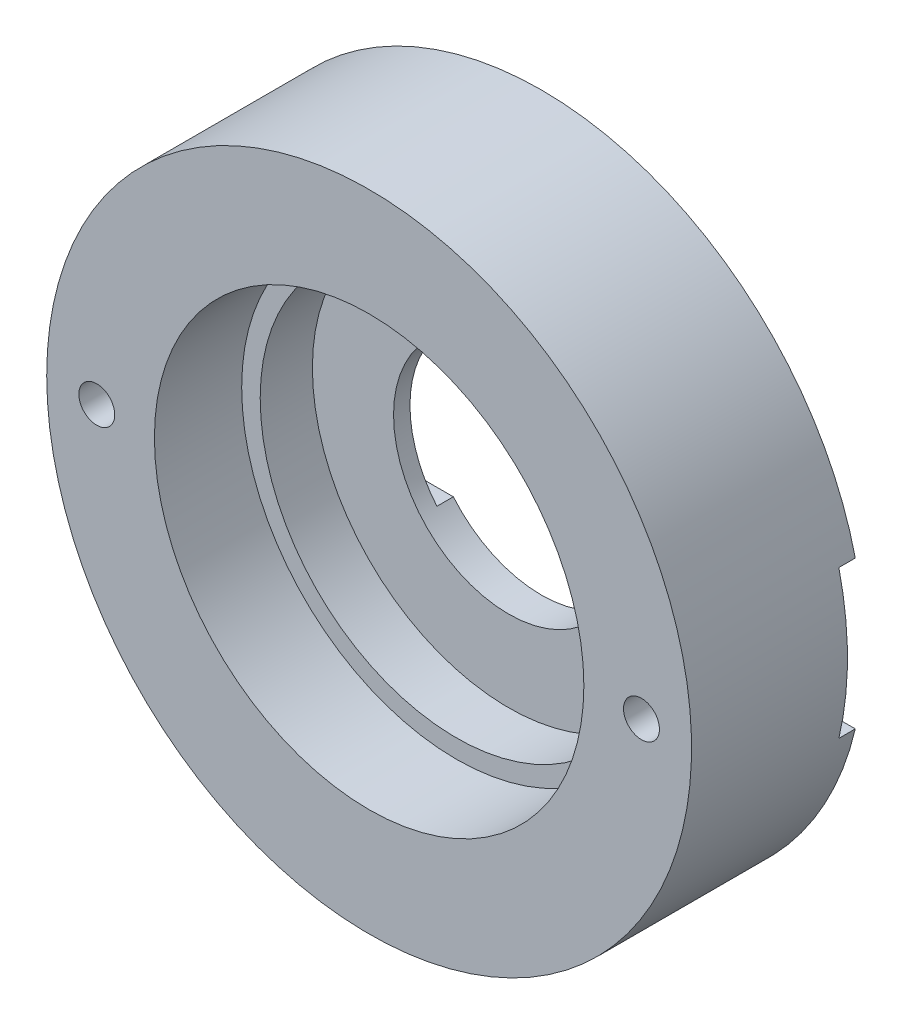
ISO-10303-21;
HEADER;
FILE_DESCRIPTION(('STEP AP214'),'2;1');
FILE_NAME('part.step','',(''),(''),'','','');
FILE_SCHEMA(('AUTOMOTIVE_DESIGN { 1 0 10303 214 1 1 1 1 }'));
ENDSEC;
DATA;
#1=APPLICATION_CONTEXT('core data for automotive mechanical design processes');
#2=APPLICATION_PROTOCOL_DEFINITION('international standard','automotive_design',2000,#1);
#3=PRODUCT_CONTEXT('',#1,'mechanical');
#4=PRODUCT('Part','Part','',(#3));
#5=PRODUCT_RELATED_PRODUCT_CATEGORY('part','',(#4));
#6=PRODUCT_DEFINITION_FORMATION('','',#4);
#7=PRODUCT_DEFINITION_CONTEXT('part definition',#1,'design');
#8=PRODUCT_DEFINITION('design','',#6,#7);
#9=PRODUCT_DEFINITION_SHAPE('','',#8);
#10=(LENGTH_UNIT() NAMED_UNIT(*) SI_UNIT(.MILLI.,.METRE.));
#11=(NAMED_UNIT(*) PLANE_ANGLE_UNIT() SI_UNIT($,.RADIAN.));
#12=(NAMED_UNIT(*) SI_UNIT($,.STERADIAN.) SOLID_ANGLE_UNIT());
#13=UNCERTAINTY_MEASURE_WITH_UNIT(LENGTH_MEASURE(1.E-05),#10,'distance_accuracy_value','');
#14=(GEOMETRIC_REPRESENTATION_CONTEXT(3) GLOBAL_UNCERTAINTY_ASSIGNED_CONTEXT((#13)) GLOBAL_UNIT_ASSIGNED_CONTEXT((#10,
#11,#12)) REPRESENTATION_CONTEXT('',''));
#15=CARTESIAN_POINT('',(0.,0.,0.));
#16=DIRECTION('',(0.,0.,1.));
#17=DIRECTION('',(1.,0.,0.));
#18=AXIS2_PLACEMENT_3D('',#15,#16,#17);
#19=CARTESIAN_POINT('',(0.,0.,-4.70047346479343));
#20=DIRECTION('',(0.,0.,-1.));
#21=DIRECTION('',(-1.,0.,0.));
#22=AXIS2_PLACEMENT_3D('',#19,#20,#21);
#23=PLANE('',#22);
#24=DIRECTION('',(-1.,0.,0.));
#25=VECTOR('',#24,1.);
#26=CARTESIAN_POINT('',(22.5619464921962,-4.5,-4.70047346479343));
#27=LINE('',#26,#25);
#28=CARTESIAN_POINT('',(19.0947333577398,-4.5,-4.70047346479343));
#29=VERTEX_POINT('',#28);
#30=CARTESIAN_POINT('',(5.3619026473818,-4.5,-4.70047346479343));
#31=VERTEX_POINT('',#30);
#32=EDGE_CURVE('E157',#29,#31,#27,.T.);
#33=ORIENTED_EDGE('',*,*,#32,.F.);
#34=CARTESIAN_POINT('',(0.,0.,-4.70047346479343));
#35=DIRECTION('',(0.,0.,-1.));
#36=DIRECTION('',(-1.,0.,0.));
#37=AXIS2_PLACEMENT_3D('',#34,#35,#36);
#38=CIRCLE('',#37,19.6178195017485);
#39=CARTESIAN_POINT('',(-19.0947333577398,-4.5,-4.70047346479343));
#40=VERTEX_POINT('',#39);
#41=EDGE_CURVE('E127',#29,#40,#38,.T.);
#42=ORIENTED_EDGE('',*,*,#41,.T.);
#43=CARTESIAN_POINT('',(-5.3619026473818,-4.5,-4.70047346479343));
#44=VERTEX_POINT('',#43);
#45=EDGE_CURVE('E118',#44,#40,#27,.T.);
#46=ORIENTED_EDGE('',*,*,#45,.F.);
#47=CARTESIAN_POINT('',(0.,0.,-4.70047346479343));
#48=DIRECTION('',(0.,0.,-1.));
#49=DIRECTION('',(-1.,0.,0.));
#50=AXIS2_PLACEMENT_3D('',#47,#48,#49);
#51=CIRCLE('',#50,7.);
#52=EDGE_CURVE('E175',#31,#44,#51,.T.);
#53=ORIENTED_EDGE('',*,*,#52,.F.);
#54=EDGE_LOOP('',(#33,#42,#46,#53));
#55=FACE_BOUND('',#54,.T.);
#56=ADVANCED_FACE('F36',(#55),#23,.T.);
#57=CARTESIAN_POINT('',(-16.57,0.,5.78452653520657));
#58=DIRECTION('',(0.,0.,-1.));
#59=DIRECTION('',(-1.,0.,0.));
#60=AXIS2_PLACEMENT_3D('',#57,#58,#59);
#61=CYLINDRICAL_SURFACE('',#60,1.0922);
#62=CARTESIAN_POINT('',(-16.57,0.,5.78452653520657));
#63=DIRECTION('',(0.,0.,-1.));
#64=DIRECTION('',(-1.,0.,0.));
#65=AXIS2_PLACEMENT_3D('',#62,#63,#64);
#66=CIRCLE('',#65,1.0922);
#67=CARTESIAN_POINT('',(-17.6622,0.,5.78452653520657));
#68=VERTEX_POINT('',#67);
#69=EDGE_CURVE('E172',#68,#68,#66,.T.);
#70=ORIENTED_EDGE('',*,*,#69,.F.);
#71=EDGE_LOOP('',(#70));
#72=FACE_BOUND('',#71,.T.);
#73=CARTESIAN_POINT('',(-16.57,0.,-3.70047346479343));
#74=DIRECTION('',(0.,0.,-1.));
#75=DIRECTION('',(-1.,0.,0.));
#76=AXIS2_PLACEMENT_3D('',#73,#74,#75);
#77=CIRCLE('',#76,1.0922);
#78=CARTESIAN_POINT('',(-17.6622,0.,-3.70047346479343));
#79=VERTEX_POINT('',#78);
#80=EDGE_CURVE('E138',#79,#79,#77,.F.);
#81=ORIENTED_EDGE('',*,*,#80,.F.);
#82=EDGE_LOOP('',(#81));
#83=FACE_BOUND('',#82,.T.);
#84=ADVANCED_FACE('F209',(#72,#83),#61,.F.);
#85=CARTESIAN_POINT('',(16.57,0.,5.78452653520657));
#86=DIRECTION('',(0.,0.,-1.));
#87=DIRECTION('',(-1.,0.,0.));
#88=AXIS2_PLACEMENT_3D('',#85,#86,#87);
#89=CYLINDRICAL_SURFACE('',#88,1.0922);
#90=CARTESIAN_POINT('',(16.57,0.,5.78452653520657));
#91=DIRECTION('',(0.,0.,-1.));
#92=DIRECTION('',(1.,0.,0.));
#93=AXIS2_PLACEMENT_3D('',#90,#91,#92);
#94=CIRCLE('',#93,1.0922);
#95=CARTESIAN_POINT('',(17.6622,0.,5.78452653520657));
#96=VERTEX_POINT('',#95);
#97=EDGE_CURVE('E169',#96,#96,#94,.T.);
#98=ORIENTED_EDGE('',*,*,#97,.F.);
#99=EDGE_LOOP('',(#98));
#100=FACE_BOUND('',#99,.T.);
#101=CARTESIAN_POINT('',(16.57,0.,-3.70047346479343));
#102=DIRECTION('',(0.,0.,-1.));
#103=DIRECTION('',(-1.,0.,0.));
#104=AXIS2_PLACEMENT_3D('',#101,#102,#103);
#105=CIRCLE('',#104,1.0922);
#106=CARTESIAN_POINT('',(15.4778,0.,-3.70047346479343));
#107=VERTEX_POINT('',#106);
#108=EDGE_CURVE('E136',#107,#107,#105,.F.);
#109=ORIENTED_EDGE('',*,*,#108,.F.);
#110=EDGE_LOOP('',(#109));
#111=FACE_BOUND('',#110,.T.);
#112=ADVANCED_FACE('F214',(#100,#111),#89,.F.);
#113=DIRECTION('',(1.,0.,0.));
#114=VECTOR('',#113,1.);
#115=CARTESIAN_POINT('',(22.5619464921962,4.5,-4.70047346479343));
#116=LINE('',#115,#114);
#117=CARTESIAN_POINT('',(-19.0947333577398,4.5,-4.70047346479343));
#118=VERTEX_POINT('',#117);
#119=CARTESIAN_POINT('',(-5.3619026473818,4.5,-4.70047346479343));
#120=VERTEX_POINT('',#119);
#121=EDGE_CURVE('E103',#118,#120,#116,.T.);
#122=ORIENTED_EDGE('',*,*,#121,.F.);
#123=CARTESIAN_POINT('',(19.0947333577398,4.5,-4.70047346479343));
#124=VERTEX_POINT('',#123);
#125=EDGE_CURVE('E115',#118,#124,#38,.T.);
#126=ORIENTED_EDGE('',*,*,#125,.T.);
#127=CARTESIAN_POINT('',(5.3619026473818,4.5,-4.70047346479343));
#128=VERTEX_POINT('',#127);
#129=EDGE_CURVE('E119',#128,#124,#116,.T.);
#130=ORIENTED_EDGE('',*,*,#129,.F.);
#131=EDGE_CURVE('E117',#120,#128,#51,.T.);
#132=ORIENTED_EDGE('',*,*,#131,.F.);
#133=EDGE_LOOP('',(#122,#126,#130,#132));
#134=FACE_BOUND('',#133,.T.);
#135=ADVANCED_FACE('F38',(#134),#23,.T.);
#136=CARTESIAN_POINT('',(0.,0.,-25.4112856059014));
#137=DIRECTION('',(0.,0.,-1.));
#138=DIRECTION('',(-1.,0.,0.));
#139=AXIS2_PLACEMENT_3D('',#136,#137,#138);
#140=CYLINDRICAL_SURFACE('',#139,19.6178195017485);
#141=DIRECTION('',(0.,0.,-1.));
#142=VECTOR('',#141,1.);
#143=CARTESIAN_POINT('',(19.0947333577398,-4.5,-25.4112856059014));
#144=LINE('',#143,#142);
#145=CARTESIAN_POINT('',(19.0947333577398,-4.5,-3.70047346479343));
#146=VERTEX_POINT('',#145);
#147=EDGE_CURVE('E165',#146,#29,#144,.T.);
#148=ORIENTED_EDGE('',*,*,#147,.F.);
#149=CARTESIAN_POINT('',(0.,0.,-3.70047346479343));
#150=DIRECTION('',(0.,0.,-1.));
#151=DIRECTION('',(-1.,0.,0.));
#152=AXIS2_PLACEMENT_3D('',#149,#150,#151);
#153=CIRCLE('',#152,19.6178195017485);
#154=CARTESIAN_POINT('',(19.0947333577398,4.5,-3.70047346479343));
#155=VERTEX_POINT('',#154);
#156=EDGE_CURVE('E109',#146,#155,#153,.F.);
#157=ORIENTED_EDGE('',*,*,#156,.T.);
#158=DIRECTION('',(0.,0.,-1.));
#159=VECTOR('',#158,1.);
#160=CARTESIAN_POINT('',(19.0947333577398,4.5,-25.4112856059014));
#161=LINE('',#160,#159);
#162=EDGE_CURVE('E108',#124,#155,#161,.F.);
#163=ORIENTED_EDGE('',*,*,#162,.F.);
#164=ORIENTED_EDGE('',*,*,#125,.F.);
#165=DIRECTION('',(0.,0.,-1.));
#166=VECTOR('',#165,1.);
#167=CARTESIAN_POINT('',(-19.0947333577398,4.5,-25.4112856059014));
#168=LINE('',#167,#166);
#169=CARTESIAN_POINT('',(-19.0947333577398,4.5,-3.70047346479343));
#170=VERTEX_POINT('',#169);
#171=EDGE_CURVE('E100',#170,#118,#168,.T.);
#172=ORIENTED_EDGE('',*,*,#171,.F.);
#173=CARTESIAN_POINT('',(-19.0947333577398,-4.5,-3.70047346479343));
#174=VERTEX_POINT('',#173);
#175=EDGE_CURVE('E162',#170,#174,#153,.F.);
#176=ORIENTED_EDGE('',*,*,#175,.T.);
#177=DIRECTION('',(0.,0.,-1.));
#178=VECTOR('',#177,1.);
#179=CARTESIAN_POINT('',(-19.0947333577398,-4.5,-25.4112856059014));
#180=LINE('',#179,#178);
#181=EDGE_CURVE('E167',#40,#174,#180,.F.);
#182=ORIENTED_EDGE('',*,*,#181,.F.);
#183=ORIENTED_EDGE('',*,*,#41,.F.);
#184=EDGE_LOOP('',(#148,#157,#163,#164,#172,#176,#182,#183));
#185=FACE_BOUND('',#184,.T.);
#186=CARTESIAN_POINT('',(0.,0.,5.78452653520657));
#187=DIRECTION('',(0.,0.,-1.));
#188=DIRECTION('',(-1.,0.,0.));
#189=AXIS2_PLACEMENT_3D('',#186,#187,#188);
#190=CIRCLE('',#189,19.6178195017485);
#191=CARTESIAN_POINT('',(-19.6178195017485,0.,5.78452653520657));
#192=VERTEX_POINT('',#191);
#193=EDGE_CURVE('E132',#192,#192,#190,.T.);
#194=ORIENTED_EDGE('',*,*,#193,.T.);
#195=EDGE_LOOP('',(#194));
#196=FACE_BOUND('',#195,.T.);
#197=ADVANCED_FACE('F123',(#185,#196),#140,.T.);
#198=CARTESIAN_POINT('',(0.,0.,5.78452653520657));
#199=DIRECTION('',(0.,0.,-1.));
#200=DIRECTION('',(-1.,0.,0.));
#201=AXIS2_PLACEMENT_3D('',#198,#199,#200);
#202=PLANE('',#201);
#203=ORIENTED_EDGE('',*,*,#97,.T.);
#204=EDGE_LOOP('',(#203));
#205=FACE_BOUND('',#204,.T.);
#206=ORIENTED_EDGE('',*,*,#69,.T.);
#207=EDGE_LOOP('',(#206));
#208=FACE_BOUND('',#207,.T.);
#209=ORIENTED_EDGE('',*,*,#193,.F.);
#210=EDGE_LOOP('',(#209));
#211=FACE_BOUND('',#210,.T.);
#212=CARTESIAN_POINT('',(0.,0.,5.78452653520657));
#213=DIRECTION('',(0.,0.,-1.));
#214=DIRECTION('',(-1.,0.,0.));
#215=AXIS2_PLACEMENT_3D('',#212,#213,#214);
#216=CIRCLE('',#215,13.0646195017485);
#217=CARTESIAN_POINT('',(-13.0646195017485,0.,5.78452653520657));
#218=VERTEX_POINT('',#217);
#219=EDGE_CURVE('E188',#218,#218,#216,.T.);
#220=ORIENTED_EDGE('',*,*,#219,.T.);
#221=EDGE_LOOP('',(#220));
#222=FACE_BOUND('',#221,.T.);
#223=ADVANCED_FACE('F195',(#205,#208,#211,#222),#202,.F.);
#224=CARTESIAN_POINT('',(0.,0.,-25.4112856059014));
#225=DIRECTION('',(0.,0.,-1.));
#226=DIRECTION('',(-1.,0.,0.));
#227=AXIS2_PLACEMENT_3D('',#224,#225,#226);
#228=CYLINDRICAL_SURFACE('',#227,13.0646195017485);
#229=ORIENTED_EDGE('',*,*,#219,.F.);
#230=EDGE_LOOP('',(#229));
#231=FACE_BOUND('',#230,.T.);
#232=CARTESIAN_POINT('',(0.,0.,0.474526535206573));
#233=DIRECTION('',(0.,0.,-1.));
#234=DIRECTION('',(-1.,0.,0.));
#235=AXIS2_PLACEMENT_3D('',#232,#233,#234);
#236=CIRCLE('',#235,13.0646195017485);
#237=CARTESIAN_POINT('',(-13.0646195017485,0.,0.474526535206573));
#238=VERTEX_POINT('',#237);
#239=EDGE_CURVE('E186',#238,#238,#236,.T.);
#240=ORIENTED_EDGE('',*,*,#239,.T.);
#241=EDGE_LOOP('',(#240));
#242=FACE_BOUND('',#241,.T.);
#243=ADVANCED_FACE('F197',(#231,#242),#228,.F.);
#244=CARTESIAN_POINT('',(0.,0.,0.474526535206571));
#245=DIRECTION('',(0.,0.,-1.));
#246=DIRECTION('',(-1.,0.,0.));
#247=AXIS2_PLACEMENT_3D('',#244,#245,#246);
#248=PLANE('',#247);
#249=ORIENTED_EDGE('',*,*,#239,.F.);
#250=EDGE_LOOP('',(#249));
#251=FACE_BOUND('',#250,.T.);
#252=CARTESIAN_POINT('',(0.,0.,0.474526535206573));
#253=DIRECTION('',(0.,0.,-1.));
#254=DIRECTION('',(-1.,0.,0.));
#255=AXIS2_PLACEMENT_3D('',#252,#253,#254);
#256=CIRCLE('',#255,11.938);
#257=CARTESIAN_POINT('',(-11.938,0.,0.474526535206573));
#258=VERTEX_POINT('',#257);
#259=EDGE_CURVE('E183',#258,#258,#256,.T.);
#260=ORIENTED_EDGE('',*,*,#259,.T.);
#261=EDGE_LOOP('',(#260));
#262=FACE_BOUND('',#261,.T.);
#263=ADVANCED_FACE('F204',(#251,#262),#248,.F.);
#264=CARTESIAN_POINT('',(0.,0.,-25.4112856059014));
#265=DIRECTION('',(0.,0.,-1.));
#266=DIRECTION('',(-1.,0.,0.));
#267=AXIS2_PLACEMENT_3D('',#264,#265,#266);
#268=CYLINDRICAL_SURFACE('',#267,11.938);
#269=ORIENTED_EDGE('',*,*,#259,.F.);
#270=EDGE_LOOP('',(#269));
#271=FACE_BOUND('',#270,.T.);
#272=CARTESIAN_POINT('',(0.,0.,-2.70047346479343));
#273=DIRECTION('',(0.,0.,-1.));
#274=DIRECTION('',(-1.,0.,0.));
#275=AXIS2_PLACEMENT_3D('',#272,#273,#274);
#276=CIRCLE('',#275,11.938);
#277=CARTESIAN_POINT('',(-11.938,0.,-2.70047346479343));
#278=VERTEX_POINT('',#277);
#279=EDGE_CURVE('E180',#278,#278,#276,.T.);
#280=ORIENTED_EDGE('',*,*,#279,.T.);
#281=EDGE_LOOP('',(#280));
#282=FACE_BOUND('',#281,.T.);
#283=ADVANCED_FACE('F237',(#271,#282),#268,.F.);
#284=CARTESIAN_POINT('',(0.,0.,-2.70047346479343));
#285=DIRECTION('',(0.,0.,-1.));
#286=DIRECTION('',(-1.,0.,0.));
#287=AXIS2_PLACEMENT_3D('',#284,#285,#286);
#288=PLANE('',#287);
#289=ORIENTED_EDGE('',*,*,#279,.F.);
#290=EDGE_LOOP('',(#289));
#291=FACE_BOUND('',#290,.T.);
#292=CARTESIAN_POINT('',(0.,0.,-2.70047346479343));
#293=DIRECTION('',(0.,0.,-1.));
#294=DIRECTION('',(-1.,0.,0.));
#295=AXIS2_PLACEMENT_3D('',#292,#293,#294);
#296=CIRCLE('',#295,7.);
#297=CARTESIAN_POINT('',(-7.,0.,-2.70047346479343));
#298=VERTEX_POINT('',#297);
#299=EDGE_CURVE('E177',#298,#298,#296,.T.);
#300=ORIENTED_EDGE('',*,*,#299,.T.);
#301=EDGE_LOOP('',(#300));
#302=FACE_BOUND('',#301,.T.);
#303=ADVANCED_FACE('F234',(#291,#302),#288,.F.);
#304=CARTESIAN_POINT('',(0.,0.,-25.4112856059014));
#305=DIRECTION('',(0.,0.,-1.));
#306=DIRECTION('',(-1.,0.,0.));
#307=AXIS2_PLACEMENT_3D('',#304,#305,#306);
#308=CYLINDRICAL_SURFACE('',#307,7.);
#309=CARTESIAN_POINT('',(0.,0.,-3.70047346479343));
#310=DIRECTION('',(0.,0.,-1.));
#311=DIRECTION('',(-1.,0.,0.));
#312=AXIS2_PLACEMENT_3D('',#309,#310,#311);
#313=CIRCLE('',#312,7.);
#314=CARTESIAN_POINT('',(5.3619026473818,-4.5,-3.70047346479343));
#315=VERTEX_POINT('',#314);
#316=CARTESIAN_POINT('',(5.3619026473818,4.5,-3.70047346479343));
#317=VERTEX_POINT('',#316);
#318=EDGE_CURVE('E146',#315,#317,#313,.F.);
#319=ORIENTED_EDGE('',*,*,#318,.F.);
#320=DIRECTION('',(0.,0.,-1.));
#321=VECTOR('',#320,1.);
#322=CARTESIAN_POINT('',(5.3619026473818,-4.5,-25.4112856059014));
#323=LINE('',#322,#321);
#324=EDGE_CURVE('E11',#315,#31,#323,.T.);
#325=ORIENTED_EDGE('',*,*,#324,.T.);
#326=ORIENTED_EDGE('',*,*,#52,.T.);
#327=DIRECTION('',(0.,0.,-1.));
#328=VECTOR('',#327,1.);
#329=CARTESIAN_POINT('',(-5.3619026473818,-4.5,-25.4112856059014));
#330=LINE('',#329,#328);
#331=CARTESIAN_POINT('',(-5.3619026473818,-4.5,-3.70047346479343));
#332=VERTEX_POINT('',#331);
#333=EDGE_CURVE('E129',#44,#332,#330,.F.);
#334=ORIENTED_EDGE('',*,*,#333,.T.);
#335=CARTESIAN_POINT('',(-5.3619026473818,4.5,-3.70047346479343));
#336=VERTEX_POINT('',#335);
#337=EDGE_CURVE('E160',#336,#332,#313,.F.);
#338=ORIENTED_EDGE('',*,*,#337,.F.);
#339=DIRECTION('',(0.,0.,-1.));
#340=VECTOR('',#339,1.);
#341=CARTESIAN_POINT('',(-5.3619026473818,4.5,-25.4112856059014));
#342=LINE('',#341,#340);
#343=EDGE_CURVE('E126',#336,#120,#342,.T.);
#344=ORIENTED_EDGE('',*,*,#343,.T.);
#345=ORIENTED_EDGE('',*,*,#131,.T.);
#346=DIRECTION('',(0.,0.,-1.));
#347=VECTOR('',#346,1.);
#348=CARTESIAN_POINT('',(5.3619026473818,4.5,-25.4112856059014));
#349=LINE('',#348,#347);
#350=EDGE_CURVE('E44',#128,#317,#349,.F.);
#351=ORIENTED_EDGE('',*,*,#350,.T.);
#352=EDGE_LOOP('',(#319,#325,#326,#334,#338,#344,#345,#351));
#353=FACE_BOUND('',#352,.T.);
#354=ORIENTED_EDGE('',*,*,#299,.F.);
#355=EDGE_LOOP('',(#354));
#356=FACE_BOUND('',#355,.T.);
#357=ADVANCED_FACE('F144',(#353,#356),#308,.F.);
#358=CARTESIAN_POINT('',(0.,0.,-3.70047346479343));
#359=DIRECTION('',(0.,0.,-1.));
#360=DIRECTION('',(-1.,0.,0.));
#361=AXIS2_PLACEMENT_3D('',#358,#359,#360);
#362=PLANE('',#361);
#363=ORIENTED_EDGE('',*,*,#108,.T.);
#364=EDGE_LOOP('',(#363));
#365=FACE_BOUND('',#364,.T.);
#366=DIRECTION('',(-1.,0.,0.));
#367=VECTOR('',#366,1.);
#368=CARTESIAN_POINT('',(22.5619464921962,-4.5,-3.70047346479343));
#369=LINE('',#368,#367);
#370=EDGE_CURVE('E51',#146,#315,#369,.T.);
#371=ORIENTED_EDGE('',*,*,#370,.T.);
#372=ORIENTED_EDGE('',*,*,#318,.T.);
#373=DIRECTION('',(1.,0.,0.));
#374=VECTOR('',#373,1.);
#375=CARTESIAN_POINT('',(22.5619464921962,4.5,-3.70047346479343));
#376=LINE('',#375,#374);
#377=EDGE_CURVE('E151',#317,#155,#376,.T.);
#378=ORIENTED_EDGE('',*,*,#377,.T.);
#379=ORIENTED_EDGE('',*,*,#156,.F.);
#380=EDGE_LOOP('',(#371,#372,#378,#379));
#381=FACE_BOUND('',#380,.T.);
#382=ADVANCED_FACE('F233',(#365,#381),#362,.T.);
#383=CARTESIAN_POINT('',(22.5619464921962,4.5,-3.70047346479343));
#384=DIRECTION('',(0.,1.,0.));
#385=DIRECTION('',(0.,0.,1.));
#386=AXIS2_PLACEMENT_3D('',#383,#384,#385);
#387=PLANE('',#386);
#388=ORIENTED_EDGE('',*,*,#162,.T.);
#389=ORIENTED_EDGE('',*,*,#377,.F.);
#390=ORIENTED_EDGE('',*,*,#350,.F.);
#391=ORIENTED_EDGE('',*,*,#129,.T.);
#392=EDGE_LOOP('',(#388,#389,#390,#391));
#393=FACE_BOUND('',#392,.T.);
#394=ADVANCED_FACE('F149',(#393),#387,.F.);
#395=CARTESIAN_POINT('',(22.5619464921962,-4.5,-3.70047346479343));
#396=DIRECTION('',(0.,-1.,0.));
#397=DIRECTION('',(0.,0.,-1.));
#398=AXIS2_PLACEMENT_3D('',#395,#396,#397);
#399=PLANE('',#398);
#400=ORIENTED_EDGE('',*,*,#147,.T.);
#401=ORIENTED_EDGE('',*,*,#32,.T.);
#402=ORIENTED_EDGE('',*,*,#324,.F.);
#403=ORIENTED_EDGE('',*,*,#370,.F.);
#404=EDGE_LOOP('',(#400,#401,#402,#403));
#405=FACE_BOUND('',#404,.T.);
#406=ADVANCED_FACE('F283',(#405),#399,.F.);
#407=ORIENTED_EDGE('',*,*,#181,.T.);
#408=EDGE_CURVE('E154',#332,#174,#369,.T.);
#409=ORIENTED_EDGE('',*,*,#408,.F.);
#410=ORIENTED_EDGE('',*,*,#333,.F.);
#411=ORIENTED_EDGE('',*,*,#45,.T.);
#412=EDGE_LOOP('',(#407,#409,#410,#411));
#413=FACE_BOUND('',#412,.T.);
#414=ADVANCED_FACE('F289',(#413),#399,.F.);
#415=ORIENTED_EDGE('',*,*,#171,.T.);
#416=ORIENTED_EDGE('',*,*,#121,.T.);
#417=ORIENTED_EDGE('',*,*,#343,.F.);
#418=EDGE_CURVE('E59',#170,#336,#376,.T.);
#419=ORIENTED_EDGE('',*,*,#418,.F.);
#420=EDGE_LOOP('',(#415,#416,#417,#419));
#421=FACE_BOUND('',#420,.T.);
#422=ADVANCED_FACE('F102',(#421),#387,.F.);
#423=ORIENTED_EDGE('',*,*,#80,.T.);
#424=EDGE_LOOP('',(#423));
#425=FACE_BOUND('',#424,.T.);
#426=ORIENTED_EDGE('',*,*,#418,.T.);
#427=ORIENTED_EDGE('',*,*,#337,.T.);
#428=ORIENTED_EDGE('',*,*,#408,.T.);
#429=ORIENTED_EDGE('',*,*,#175,.F.);
#430=EDGE_LOOP('',(#426,#427,#428,#429));
#431=FACE_BOUND('',#430,.T.);
#432=ADVANCED_FACE('F277',(#425,#431),#362,.T.);
#433=CLOSED_SHELL('',(#56,#84,#112,#135,#197,#223,#243,#263,#283,#303,#357,#382,#394,#406,#414,
#422,#432));
#434=MANIFOLD_SOLID_BREP('B2',#433);
#435=ADVANCED_BREP_SHAPE_REPRESENTATION('',(#18,#434),#14);
#436=SHAPE_DEFINITION_REPRESENTATION(#9,#435);
ENDSEC;
END-ISO-10303-21;
